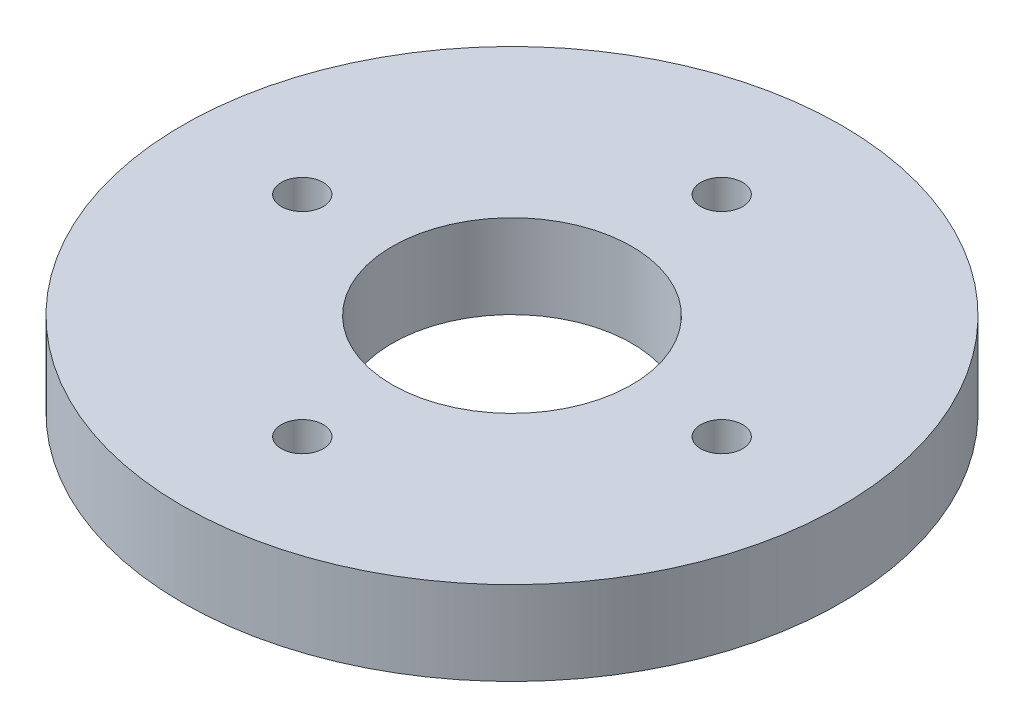
ISO-10303-21;
HEADER;
FILE_DESCRIPTION(('STEP AP214'),'2;1');
FILE_NAME('part.step','',(''),(''),'','','');
FILE_SCHEMA(('AUTOMOTIVE_DESIGN { 1 0 10303 214 1 1 1 1 }'));
ENDSEC;
DATA;
#1=APPLICATION_CONTEXT('core data for automotive mechanical design processes');
#2=APPLICATION_PROTOCOL_DEFINITION('international standard','automotive_design',2000,#1);
#3=PRODUCT_CONTEXT('',#1,'mechanical');
#4=PRODUCT('Part','Part','',(#3));
#5=PRODUCT_RELATED_PRODUCT_CATEGORY('part','',(#4));
#6=PRODUCT_DEFINITION_FORMATION('','',#4);
#7=PRODUCT_DEFINITION_CONTEXT('part definition',#1,'design');
#8=PRODUCT_DEFINITION('design','',#6,#7);
#9=PRODUCT_DEFINITION_SHAPE('','',#8);
#10=(LENGTH_UNIT() NAMED_UNIT(*) SI_UNIT(.MILLI.,.METRE.));
#11=(NAMED_UNIT(*) PLANE_ANGLE_UNIT() SI_UNIT($,.RADIAN.));
#12=(NAMED_UNIT(*) SI_UNIT($,.STERADIAN.) SOLID_ANGLE_UNIT());
#13=UNCERTAINTY_MEASURE_WITH_UNIT(LENGTH_MEASURE(1.E-05),#10,'distance_accuracy_value','');
#14=(GEOMETRIC_REPRESENTATION_CONTEXT(3) GLOBAL_UNCERTAINTY_ASSIGNED_CONTEXT((#13)) GLOBAL_UNIT_ASSIGNED_CONTEXT((#10,
#11,#12)) REPRESENTATION_CONTEXT('',''));
#15=CARTESIAN_POINT('',(0.,0.,0.));
#16=DIRECTION('',(0.,0.,1.));
#17=DIRECTION('',(1.,0.,0.));
#18=AXIS2_PLACEMENT_3D('',#15,#16,#17);
#19=CARTESIAN_POINT('',(0.,28.,0.));
#20=DIRECTION('',(0.,1.,0.));
#21=DIRECTION('',(0.,0.,1.));
#22=AXIS2_PLACEMENT_3D('',#19,#20,#21);
#23=PLANE('',#22);
#24=CARTESIAN_POINT('',(0.,28.,-70.));
#25=DIRECTION('',(0.,1.,0.));
#26=DIRECTION('',(0.,0.,1.));
#27=AXIS2_PLACEMENT_3D('',#24,#25,#26);
#28=CIRCLE('',#27,7.);
#29=CARTESIAN_POINT('',(0.,28.,-63.));
#30=VERTEX_POINT('',#29);
#31=EDGE_CURVE('E63',#30,#30,#28,.T.);
#32=ORIENTED_EDGE('',*,*,#31,.F.);
#33=EDGE_LOOP('',(#32));
#34=FACE_BOUND('',#33,.T.);
#35=CARTESIAN_POINT('',(70.,28.,0.));
#36=DIRECTION('',(0.,1.,0.));
#37=DIRECTION('',(0.,0.,1.));
#38=AXIS2_PLACEMENT_3D('',#35,#36,#37);
#39=CIRCLE('',#38,7.);
#40=CARTESIAN_POINT('',(70.,28.,7.));
#41=VERTEX_POINT('',#40);
#42=EDGE_CURVE('E51',#41,#41,#39,.T.);
#43=ORIENTED_EDGE('',*,*,#42,.F.);
#44=EDGE_LOOP('',(#43));
#45=FACE_BOUND('',#44,.T.);
#46=CARTESIAN_POINT('',(0.,28.,0.));
#47=DIRECTION('',(0.,1.,0.));
#48=DIRECTION('',(0.,0.,1.));
#49=AXIS2_PLACEMENT_3D('',#46,#47,#48);
#50=CIRCLE('',#49,110.);
#51=CARTESIAN_POINT('',(0.,28.,110.));
#52=VERTEX_POINT('',#51);
#53=EDGE_CURVE('E10',#52,#52,#50,.T.);
#54=ORIENTED_EDGE('',*,*,#53,.T.);
#55=EDGE_LOOP('',(#54));
#56=FACE_BOUND('',#55,.T.);
#57=CARTESIAN_POINT('',(0.,28.,0.));
#58=DIRECTION('',(0.,1.,0.));
#59=DIRECTION('',(0.,0.,1.));
#60=AXIS2_PLACEMENT_3D('',#57,#58,#59);
#61=CIRCLE('',#60,40.);
#62=CARTESIAN_POINT('',(0.,28.,40.));
#63=VERTEX_POINT('',#62);
#64=EDGE_CURVE('E46',#63,#63,#61,.T.);
#65=ORIENTED_EDGE('',*,*,#64,.F.);
#66=EDGE_LOOP('',(#65));
#67=FACE_BOUND('',#66,.T.);
#68=CARTESIAN_POINT('',(-70.,28.,0.));
#69=DIRECTION('',(0.,1.,0.));
#70=DIRECTION('',(0.,0.,1.));
#71=AXIS2_PLACEMENT_3D('',#68,#69,#70);
#72=CIRCLE('',#71,7.);
#73=CARTESIAN_POINT('',(-70.,28.,7.));
#74=VERTEX_POINT('',#73);
#75=EDGE_CURVE('E57',#74,#74,#72,.T.);
#76=ORIENTED_EDGE('',*,*,#75,.F.);
#77=EDGE_LOOP('',(#76));
#78=FACE_BOUND('',#77,.T.);
#79=CARTESIAN_POINT('',(0.,28.,70.));
#80=DIRECTION('',(0.,1.,0.));
#81=DIRECTION('',(0.,0.,1.));
#82=AXIS2_PLACEMENT_3D('',#79,#80,#81);
#83=CIRCLE('',#82,7.);
#84=CARTESIAN_POINT('',(0.,28.,77.));
#85=VERTEX_POINT('',#84);
#86=EDGE_CURVE('E69',#85,#85,#83,.T.);
#87=ORIENTED_EDGE('',*,*,#86,.F.);
#88=EDGE_LOOP('',(#87));
#89=FACE_BOUND('',#88,.T.);
#90=ADVANCED_FACE('F35',(#34,#45,#56,#67,#78,#89),#23,.T.);
#91=CARTESIAN_POINT('',(0.,0.,0.));
#92=DIRECTION('',(0.,1.,0.));
#93=DIRECTION('',(0.,0.,1.));
#94=AXIS2_PLACEMENT_3D('',#91,#92,#93);
#95=PLANE('',#94);
#96=CARTESIAN_POINT('',(0.,0.,0.));
#97=DIRECTION('',(0.,1.,0.));
#98=DIRECTION('',(0.,0.,1.));
#99=AXIS2_PLACEMENT_3D('',#96,#97,#98);
#100=CIRCLE('',#99,110.);
#101=CARTESIAN_POINT('',(0.,0.,110.));
#102=VERTEX_POINT('',#101);
#103=EDGE_CURVE('E39',#102,#102,#100,.T.);
#104=ORIENTED_EDGE('',*,*,#103,.F.);
#105=EDGE_LOOP('',(#104));
#106=FACE_BOUND('',#105,.T.);
#107=CARTESIAN_POINT('',(0.,0.,0.));
#108=DIRECTION('',(0.,1.,0.));
#109=DIRECTION('',(0.,0.,1.));
#110=AXIS2_PLACEMENT_3D('',#107,#108,#109);
#111=CIRCLE('',#110,40.);
#112=CARTESIAN_POINT('',(0.,0.,40.));
#113=VERTEX_POINT('',#112);
#114=EDGE_CURVE('E48',#113,#113,#111,.T.);
#115=ORIENTED_EDGE('',*,*,#114,.T.);
#116=EDGE_LOOP('',(#115));
#117=FACE_BOUND('',#116,.T.);
#118=CARTESIAN_POINT('',(70.,0.,0.));
#119=DIRECTION('',(0.,1.,0.));
#120=DIRECTION('',(0.,0.,1.));
#121=AXIS2_PLACEMENT_3D('',#118,#119,#120);
#122=CIRCLE('',#121,7.);
#123=CARTESIAN_POINT('',(70.,0.,7.));
#124=VERTEX_POINT('',#123);
#125=EDGE_CURVE('E54',#124,#124,#122,.T.);
#126=ORIENTED_EDGE('',*,*,#125,.T.);
#127=EDGE_LOOP('',(#126));
#128=FACE_BOUND('',#127,.T.);
#129=CARTESIAN_POINT('',(-70.,0.,0.));
#130=DIRECTION('',(0.,1.,0.));
#131=DIRECTION('',(0.,0.,1.));
#132=AXIS2_PLACEMENT_3D('',#129,#130,#131);
#133=CIRCLE('',#132,7.);
#134=CARTESIAN_POINT('',(-70.,0.,7.));
#135=VERTEX_POINT('',#134);
#136=EDGE_CURVE('E60',#135,#135,#133,.T.);
#137=ORIENTED_EDGE('',*,*,#136,.T.);
#138=EDGE_LOOP('',(#137));
#139=FACE_BOUND('',#138,.T.);
#140=CARTESIAN_POINT('',(0.,0.,-70.));
#141=DIRECTION('',(0.,1.,0.));
#142=DIRECTION('',(0.,0.,1.));
#143=AXIS2_PLACEMENT_3D('',#140,#141,#142);
#144=CIRCLE('',#143,7.);
#145=CARTESIAN_POINT('',(0.,0.,-63.));
#146=VERTEX_POINT('',#145);
#147=EDGE_CURVE('E66',#146,#146,#144,.T.);
#148=ORIENTED_EDGE('',*,*,#147,.T.);
#149=EDGE_LOOP('',(#148));
#150=FACE_BOUND('',#149,.T.);
#151=CARTESIAN_POINT('',(0.,0.,70.));
#152=DIRECTION('',(0.,1.,0.));
#153=DIRECTION('',(0.,0.,1.));
#154=AXIS2_PLACEMENT_3D('',#151,#152,#153);
#155=CIRCLE('',#154,7.);
#156=CARTESIAN_POINT('',(0.,0.,77.));
#157=VERTEX_POINT('',#156);
#158=EDGE_CURVE('E72',#157,#157,#155,.T.);
#159=ORIENTED_EDGE('',*,*,#158,.T.);
#160=EDGE_LOOP('',(#159));
#161=FACE_BOUND('',#160,.T.);
#162=ADVANCED_FACE('F82',(#106,#117,#128,#139,#150,#161),#95,.F.);
#163=CARTESIAN_POINT('',(0.,28.,0.));
#164=DIRECTION('',(0.,-1.,0.));
#165=DIRECTION('',(0.,0.,-1.));
#166=AXIS2_PLACEMENT_3D('',#163,#164,#165);
#167=CYLINDRICAL_SURFACE('',#166,110.);
#168=ORIENTED_EDGE('',*,*,#53,.F.);
#169=EDGE_LOOP('',(#168));
#170=FACE_BOUND('',#169,.T.);
#171=ORIENTED_EDGE('',*,*,#103,.T.);
#172=EDGE_LOOP('',(#171));
#173=FACE_BOUND('',#172,.T.);
#174=ADVANCED_FACE('F37',(#170,#173),#167,.T.);
#175=CARTESIAN_POINT('',(0.,28.,0.));
#176=DIRECTION('',(0.,-1.,0.));
#177=DIRECTION('',(0.,0.,-1.));
#178=AXIS2_PLACEMENT_3D('',#175,#176,#177);
#179=CYLINDRICAL_SURFACE('',#178,40.);
#180=ORIENTED_EDGE('',*,*,#64,.T.);
#181=EDGE_LOOP('',(#180));
#182=FACE_BOUND('',#181,.T.);
#183=ORIENTED_EDGE('',*,*,#114,.F.);
#184=EDGE_LOOP('',(#183));
#185=FACE_BOUND('',#184,.T.);
#186=ADVANCED_FACE('F92',(#182,#185),#179,.F.);
#187=CARTESIAN_POINT('',(70.,28.,0.));
#188=DIRECTION('',(0.,-1.,0.));
#189=DIRECTION('',(0.,0.,-1.));
#190=AXIS2_PLACEMENT_3D('',#187,#188,#189);
#191=CYLINDRICAL_SURFACE('',#190,7.);
#192=ORIENTED_EDGE('',*,*,#42,.T.);
#193=EDGE_LOOP('',(#192));
#194=FACE_BOUND('',#193,.T.);
#195=ORIENTED_EDGE('',*,*,#125,.F.);
#196=EDGE_LOOP('',(#195));
#197=FACE_BOUND('',#196,.T.);
#198=ADVANCED_FACE('F95',(#194,#197),#191,.F.);
#199=CARTESIAN_POINT('',(-70.,28.,0.));
#200=DIRECTION('',(0.,-1.,0.));
#201=DIRECTION('',(0.,0.,-1.));
#202=AXIS2_PLACEMENT_3D('',#199,#200,#201);
#203=CYLINDRICAL_SURFACE('',#202,7.);
#204=ORIENTED_EDGE('',*,*,#75,.T.);
#205=EDGE_LOOP('',(#204));
#206=FACE_BOUND('',#205,.T.);
#207=ORIENTED_EDGE('',*,*,#136,.F.);
#208=EDGE_LOOP('',(#207));
#209=FACE_BOUND('',#208,.T.);
#210=ADVANCED_FACE('F99',(#206,#209),#203,.F.);
#211=CARTESIAN_POINT('',(0.,28.,-70.));
#212=DIRECTION('',(0.,-1.,0.));
#213=DIRECTION('',(0.,0.,-1.));
#214=AXIS2_PLACEMENT_3D('',#211,#212,#213);
#215=CYLINDRICAL_SURFACE('',#214,7.);
#216=ORIENTED_EDGE('',*,*,#31,.T.);
#217=EDGE_LOOP('',(#216));
#218=FACE_BOUND('',#217,.T.);
#219=ORIENTED_EDGE('',*,*,#147,.F.);
#220=EDGE_LOOP('',(#219));
#221=FACE_BOUND('',#220,.T.);
#222=ADVANCED_FACE('F103',(#218,#221),#215,.F.);
#223=CARTESIAN_POINT('',(0.,28.,70.));
#224=DIRECTION('',(0.,-1.,0.));
#225=DIRECTION('',(0.,0.,-1.));
#226=AXIS2_PLACEMENT_3D('',#223,#224,#225);
#227=CYLINDRICAL_SURFACE('',#226,7.);
#228=ORIENTED_EDGE('',*,*,#86,.T.);
#229=EDGE_LOOP('',(#228));
#230=FACE_BOUND('',#229,.T.);
#231=ORIENTED_EDGE('',*,*,#158,.F.);
#232=EDGE_LOOP('',(#231));
#233=FACE_BOUND('',#232,.T.);
#234=ADVANCED_FACE('F78',(#230,#233),#227,.F.);
#235=CLOSED_SHELL('',(#90,#162,#174,#186,#198,#210,#222,#234));
#236=MANIFOLD_SOLID_BREP('B2',#235);
#237=ADVANCED_BREP_SHAPE_REPRESENTATION('',(#18,#236),#14);
#238=SHAPE_DEFINITION_REPRESENTATION(#9,#237);
ENDSEC;
END-ISO-10303-21;
